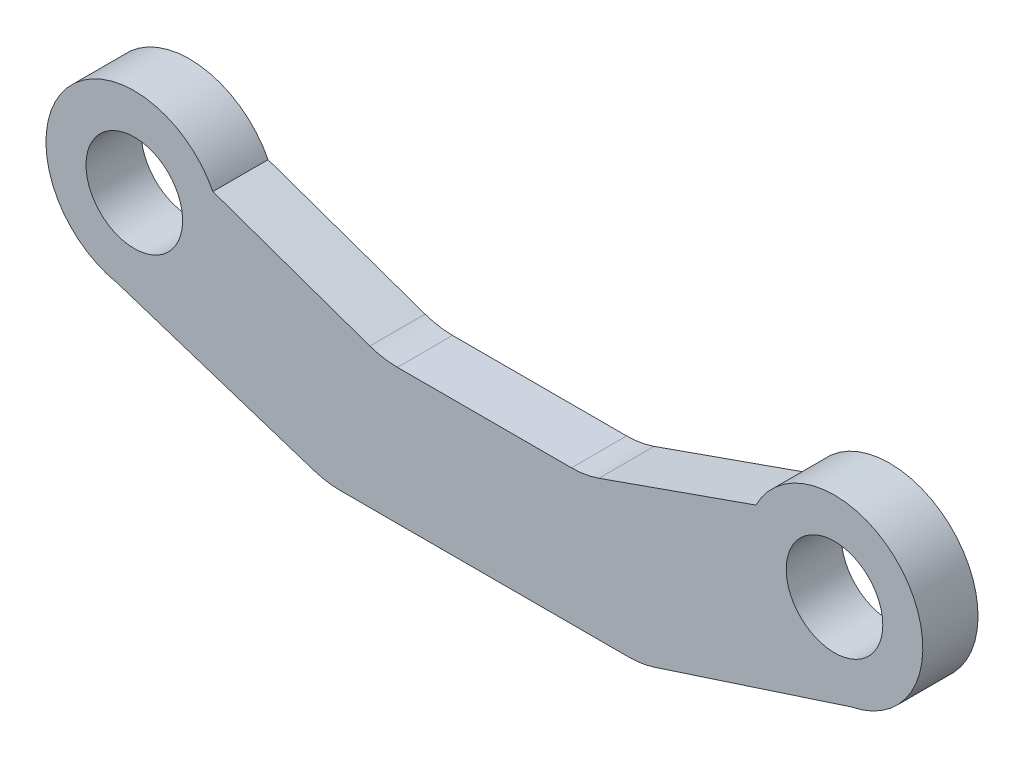
ISO-10303-21;
HEADER;
FILE_DESCRIPTION(('STEP AP214'),'2;1');
FILE_NAME('part.step','',(''),(''),'','','');
FILE_SCHEMA(('AUTOMOTIVE_DESIGN { 1 0 10303 214 1 1 1 1 }'));
ENDSEC;
DATA;
#1=APPLICATION_CONTEXT('core data for automotive mechanical design processes');
#2=APPLICATION_PROTOCOL_DEFINITION('international standard','automotive_design',2000,#1);
#3=PRODUCT_CONTEXT('',#1,'mechanical');
#4=PRODUCT('Part','Part','',(#3));
#5=PRODUCT_RELATED_PRODUCT_CATEGORY('part','',(#4));
#6=PRODUCT_DEFINITION_FORMATION('','',#4);
#7=PRODUCT_DEFINITION_CONTEXT('part definition',#1,'design');
#8=PRODUCT_DEFINITION('design','',#6,#7);
#9=PRODUCT_DEFINITION_SHAPE('','',#8);
#10=(LENGTH_UNIT() NAMED_UNIT(*) SI_UNIT(.MILLI.,.METRE.));
#11=(NAMED_UNIT(*) PLANE_ANGLE_UNIT() SI_UNIT($,.RADIAN.));
#12=(NAMED_UNIT(*) SI_UNIT($,.STERADIAN.) SOLID_ANGLE_UNIT());
#13=UNCERTAINTY_MEASURE_WITH_UNIT(LENGTH_MEASURE(1.E-05),#10,'distance_accuracy_value','');
#14=(GEOMETRIC_REPRESENTATION_CONTEXT(3) GLOBAL_UNCERTAINTY_ASSIGNED_CONTEXT((#13)) GLOBAL_UNIT_ASSIGNED_CONTEXT((#10,
#11,#12)) REPRESENTATION_CONTEXT('',''));
#15=CARTESIAN_POINT('',(0.,0.,0.));
#16=DIRECTION('',(0.,0.,1.));
#17=DIRECTION('',(1.,0.,0.));
#18=AXIS2_PLACEMENT_3D('',#15,#16,#17);
#19=CARTESIAN_POINT('',(6.41938624719755,28.8846796900789,2.));
#20=DIRECTION('',(0.,0.,-1.));
#21=DIRECTION('',(-1.,0.,0.));
#22=AXIS2_PLACEMENT_3D('',#19,#20,#21);
#23=PLANE('',#22);
#24=CARTESIAN_POINT('',(6.41938624719755,28.8846796900789,2.));
#25=DIRECTION('',(0.,0.,1.));
#26=DIRECTION('',(-1.,0.,0.));
#27=AXIS2_PLACEMENT_3D('',#24,#25,#26);
#28=CIRCLE('',#27,3.2);
#29=CARTESIAN_POINT('',(9.26564441233232,30.3471483076579,2.));
#30=VERTEX_POINT('',#29);
#31=CARTESIAN_POINT('',(5.79564441233232,25.7460579984061,2.));
#32=VERTEX_POINT('',#31);
#33=EDGE_CURVE('E200',#30,#32,#28,.T.);
#34=ORIENTED_EDGE('',*,*,#33,.T.);
#35=DIRECTION('',(0.950985081897638,-0.309236760441161,0.));
#36=VECTOR('',#35,1.);
#37=CARTESIAN_POINT('',(12.9434427804246,23.4217712627773,2.));
#38=LINE('',#37,#36);
#39=CARTESIAN_POINT('',(12.9434427804246,23.4217712627773,2.));
#40=VERTEX_POINT('',#39);
#41=EDGE_CURVE('E112',#32,#40,#38,.T.);
#42=ORIENTED_EDGE('',*,*,#41,.T.);
#43=CARTESIAN_POINT('',(13.8711530617481,26.2747265084703,2.));
#44=DIRECTION('',(0.,0.,1.));
#45=DIRECTION('',(1.,0.,0.));
#46=AXIS2_PLACEMENT_3D('',#43,#44,#45);
#47=CIRCLE('',#46,3.);
#48=CARTESIAN_POINT('',(13.8711530617481,23.2747265084703,2.));
#49=VERTEX_POINT('',#48);
#50=EDGE_CURVE('E237',#40,#49,#47,.T.);
#51=ORIENTED_EDGE('',*,*,#50,.T.);
#52=DIRECTION('',(1.,0.,0.));
#53=VECTOR('',#52,1.);
#54=CARTESIAN_POINT('',(13.8711530617481,23.2747265084703,2.));
#55=LINE('',#54,#53);
#56=CARTESIAN_POINT('',(24.3301357629165,23.2747265084703,2.));
#57=VERTEX_POINT('',#56);
#58=EDGE_CURVE('E257',#49,#57,#55,.T.);
#59=ORIENTED_EDGE('',*,*,#58,.T.);
#60=CARTESIAN_POINT('',(24.3301357629165,26.2747265084703,2.));
#61=DIRECTION('',(0.,0.,1.));
#62=DIRECTION('',(1.,0.,0.));
#63=AXIS2_PLACEMENT_3D('',#60,#61,#62);
#64=CIRCLE('',#63,3.);
#65=CARTESIAN_POINT('',(25.25784604424,23.4217712627773,2.));
#66=VERTEX_POINT('',#65);
#67=EDGE_CURVE('E253',#57,#66,#64,.T.);
#68=ORIENTED_EDGE('',*,*,#67,.T.);
#69=DIRECTION('',(0.950985081897637,0.309236760441161,0.));
#70=VECTOR('',#69,1.);
#71=CARTESIAN_POINT('',(25.25784604424,23.4217712627773,2.));
#72=LINE('',#71,#70);
#73=CARTESIAN_POINT('',(32.4056444123323,25.7460579984061,2.));
#74=VERTEX_POINT('',#73);
#75=EDGE_CURVE('E256',#66,#74,#72,.T.);
#76=ORIENTED_EDGE('',*,*,#75,.T.);
#77=CARTESIAN_POINT('',(31.7819025774671,28.8846796900789,2.));
#78=DIRECTION('',(0.,0.,1.));
#79=DIRECTION('',(1.,0.,0.));
#80=AXIS2_PLACEMENT_3D('',#77,#78,#79);
#81=CIRCLE('',#80,3.2);
#82=CARTESIAN_POINT('',(28.9356444123323,30.3471483076579,2.));
#83=VERTEX_POINT('',#82);
#84=EDGE_CURVE('E261',#74,#83,#81,.T.);
#85=ORIENTED_EDGE('',*,*,#84,.T.);
#86=DIRECTION('',(-0.943240770521756,-0.332109693964998,0.));
#87=VECTOR('',#86,1.);
#88=CARTESIAN_POINT('',(23.2492582934097,28.345004196905,2.));
#89=LINE('',#88,#87);
#90=CARTESIAN_POINT('',(23.2492582934097,28.345004196905,2.));
#91=VERTEX_POINT('',#90);
#92=EDGE_CURVE('E268',#83,#91,#89,.T.);
#93=ORIENTED_EDGE('',*,*,#92,.T.);
#94=CARTESIAN_POINT('',(22.2529292115147,31.1747265084703,2.));
#95=DIRECTION('',(0.,0.,-1.));
#96=DIRECTION('',(1.,0.,0.));
#97=AXIS2_PLACEMENT_3D('',#94,#95,#96);
#98=CIRCLE('',#97,3.);
#99=CARTESIAN_POINT('',(22.2529292115147,28.1747265084703,2.));
#100=VERTEX_POINT('',#99);
#101=EDGE_CURVE('E143',#91,#100,#98,.T.);
#102=ORIENTED_EDGE('',*,*,#101,.T.);
#103=DIRECTION('',(-1.,0.,0.));
#104=VECTOR('',#103,1.);
#105=CARTESIAN_POINT('',(15.9483596131499,28.1747265084703,2.));
#106=LINE('',#105,#104);
#107=CARTESIAN_POINT('',(15.9483596131499,28.1747265084703,2.));
#108=VERTEX_POINT('',#107);
#109=EDGE_CURVE('E137',#100,#108,#106,.T.);
#110=ORIENTED_EDGE('',*,*,#109,.T.);
#111=CARTESIAN_POINT('',(15.9483596131499,31.1747265084703,2.));
#112=DIRECTION('',(0.,0.,-1.));
#113=DIRECTION('',(1.,0.,0.));
#114=AXIS2_PLACEMENT_3D('',#111,#112,#113);
#115=CIRCLE('',#114,3.);
#116=CARTESIAN_POINT('',(14.9520305312549,28.345004196905,2.));
#117=VERTEX_POINT('',#116);
#118=EDGE_CURVE('E141',#108,#117,#115,.T.);
#119=ORIENTED_EDGE('',*,*,#118,.T.);
#120=DIRECTION('',(-0.943240770521756,0.332109693964998,0.));
#121=VECTOR('',#120,1.);
#122=CARTESIAN_POINT('',(14.9520305312549,28.345004196905,2.));
#123=LINE('',#122,#121);
#124=EDGE_CURVE('E57',#117,#30,#123,.T.);
#125=ORIENTED_EDGE('',*,*,#124,.T.);
#126=EDGE_LOOP('',(#34,#42,#51,#59,#68,#76,#85,#93,#102,#110,#119,#125));
#127=FACE_BOUND('',#126,.T.);
#128=CARTESIAN_POINT('',(6.41938624719755,28.8846796900789,2.));
#129=DIRECTION('',(0.,0.,1.));
#130=DIRECTION('',(-1.,0.,0.));
#131=AXIS2_PLACEMENT_3D('',#128,#129,#130);
#132=CIRCLE('',#131,1.75);
#133=CARTESIAN_POINT('',(4.66938624719754,28.8846796900789,2.));
#134=VERTEX_POINT('',#133);
#135=EDGE_CURVE('E170',#134,#134,#132,.T.);
#136=ORIENTED_EDGE('',*,*,#135,.F.);
#137=EDGE_LOOP('',(#136));
#138=FACE_BOUND('',#137,.T.);
#139=CARTESIAN_POINT('',(31.7819025774671,28.8846796900789,2.));
#140=DIRECTION('',(0.,0.,1.));
#141=DIRECTION('',(1.,0.,0.));
#142=AXIS2_PLACEMENT_3D('',#139,#140,#141);
#143=CIRCLE('',#142,1.75);
#144=CARTESIAN_POINT('',(33.5319025774671,28.8846796900789,2.));
#145=VERTEX_POINT('',#144);
#146=EDGE_CURVE('E311',#145,#145,#143,.T.);
#147=ORIENTED_EDGE('',*,*,#146,.F.);
#148=EDGE_LOOP('',(#147));
#149=FACE_BOUND('',#148,.T.);
#150=ADVANCED_FACE('F39',(#127,#138,#149),#23,.F.);
#151=CARTESIAN_POINT('',(6.41938624719755,28.8846796900789,0.));
#152=DIRECTION('',(0.,0.,-1.));
#153=DIRECTION('',(-1.,0.,0.));
#154=AXIS2_PLACEMENT_3D('',#151,#152,#153);
#155=PLANE('',#154);
#156=CARTESIAN_POINT('',(6.41938624719755,28.8846796900789,0.));
#157=DIRECTION('',(0.,0.,1.));
#158=DIRECTION('',(-1.,0.,0.));
#159=AXIS2_PLACEMENT_3D('',#156,#157,#158);
#160=CIRCLE('',#159,1.75);
#161=CARTESIAN_POINT('',(4.66938624719754,28.8846796900789,0.));
#162=VERTEX_POINT('',#161);
#163=EDGE_CURVE('E318',#162,#162,#160,.T.);
#164=ORIENTED_EDGE('',*,*,#163,.T.);
#165=EDGE_LOOP('',(#164));
#166=FACE_BOUND('',#165,.T.);
#167=CARTESIAN_POINT('',(6.41938624719755,28.8846796900789,0.));
#168=DIRECTION('',(0.,0.,1.));
#169=DIRECTION('',(-1.,0.,0.));
#170=AXIS2_PLACEMENT_3D('',#167,#168,#169);
#171=CIRCLE('',#170,3.2);
#172=CARTESIAN_POINT('',(9.26564441233232,30.3471483076579,0.));
#173=VERTEX_POINT('',#172);
#174=CARTESIAN_POINT('',(5.79564441233232,25.7460579984061,0.));
#175=VERTEX_POINT('',#174);
#176=EDGE_CURVE('E165',#173,#175,#171,.T.);
#177=ORIENTED_EDGE('',*,*,#176,.F.);
#178=DIRECTION('',(-0.943240770521756,0.332109693964998,0.));
#179=VECTOR('',#178,1.);
#180=CARTESIAN_POINT('',(14.9520305312549,28.345004196905,0.));
#181=LINE('',#180,#179);
#182=CARTESIAN_POINT('',(14.9520305312549,28.345004196905,0.));
#183=VERTEX_POINT('',#182);
#184=EDGE_CURVE('E104',#183,#173,#181,.T.);
#185=ORIENTED_EDGE('',*,*,#184,.F.);
#186=CARTESIAN_POINT('',(15.9483596131499,31.1747265084703,0.));
#187=DIRECTION('',(0.,0.,-1.));
#188=DIRECTION('',(1.,0.,0.));
#189=AXIS2_PLACEMENT_3D('',#186,#187,#188);
#190=CIRCLE('',#189,3.);
#191=CARTESIAN_POINT('',(15.9483596131499,28.1747265084703,0.));
#192=VERTEX_POINT('',#191);
#193=EDGE_CURVE('E98',#192,#183,#190,.T.);
#194=ORIENTED_EDGE('',*,*,#193,.F.);
#195=DIRECTION('',(-1.,0.,0.));
#196=VECTOR('',#195,1.);
#197=CARTESIAN_POINT('',(15.9483596131499,28.1747265084703,0.));
#198=LINE('',#197,#196);
#199=CARTESIAN_POINT('',(22.2529292115147,28.1747265084703,0.));
#200=VERTEX_POINT('',#199);
#201=EDGE_CURVE('E152',#200,#192,#198,.T.);
#202=ORIENTED_EDGE('',*,*,#201,.F.);
#203=CARTESIAN_POINT('',(22.2529292115147,31.1747265084703,0.));
#204=DIRECTION('',(0.,0.,-1.));
#205=DIRECTION('',(1.,0.,0.));
#206=AXIS2_PLACEMENT_3D('',#203,#204,#205);
#207=CIRCLE('',#206,3.);
#208=CARTESIAN_POINT('',(23.2492582934097,28.345004196905,0.));
#209=VERTEX_POINT('',#208);
#210=EDGE_CURVE('E191',#209,#200,#207,.T.);
#211=ORIENTED_EDGE('',*,*,#210,.F.);
#212=DIRECTION('',(-0.943240770521756,-0.332109693964998,0.));
#213=VECTOR('',#212,1.);
#214=CARTESIAN_POINT('',(23.2492582934097,28.345004196905,0.));
#215=LINE('',#214,#213);
#216=CARTESIAN_POINT('',(28.9356444123323,30.3471483076579,0.));
#217=VERTEX_POINT('',#216);
#218=EDGE_CURVE('E188',#217,#209,#215,.T.);
#219=ORIENTED_EDGE('',*,*,#218,.F.);
#220=CARTESIAN_POINT('',(31.7819025774671,28.8846796900789,0.));
#221=DIRECTION('',(0.,0.,1.));
#222=DIRECTION('',(1.,0.,0.));
#223=AXIS2_PLACEMENT_3D('',#220,#221,#222);
#224=CIRCLE('',#223,3.2);
#225=CARTESIAN_POINT('',(32.4056444123323,25.7460579984061,0.));
#226=VERTEX_POINT('',#225);
#227=EDGE_CURVE('E185',#226,#217,#224,.T.);
#228=ORIENTED_EDGE('',*,*,#227,.F.);
#229=DIRECTION('',(0.950985081897637,0.309236760441161,0.));
#230=VECTOR('',#229,1.);
#231=CARTESIAN_POINT('',(25.25784604424,23.4217712627773,0.));
#232=LINE('',#231,#230);
#233=CARTESIAN_POINT('',(25.25784604424,23.4217712627773,0.));
#234=VERTEX_POINT('',#233);
#235=EDGE_CURVE('E182',#234,#226,#232,.T.);
#236=ORIENTED_EDGE('',*,*,#235,.F.);
#237=CARTESIAN_POINT('',(24.3301357629165,26.2747265084703,0.));
#238=DIRECTION('',(0.,0.,1.));
#239=DIRECTION('',(1.,0.,0.));
#240=AXIS2_PLACEMENT_3D('',#237,#238,#239);
#241=CIRCLE('',#240,3.);
#242=CARTESIAN_POINT('',(24.3301357629165,23.2747265084703,0.));
#243=VERTEX_POINT('',#242);
#244=EDGE_CURVE('E179',#243,#234,#241,.T.);
#245=ORIENTED_EDGE('',*,*,#244,.F.);
#246=DIRECTION('',(1.,0.,0.));
#247=VECTOR('',#246,1.);
#248=CARTESIAN_POINT('',(13.8711530617481,23.2747265084703,0.));
#249=LINE('',#248,#247);
#250=CARTESIAN_POINT('',(13.8711530617481,23.2747265084703,0.));
#251=VERTEX_POINT('',#250);
#252=EDGE_CURVE('E176',#251,#243,#249,.T.);
#253=ORIENTED_EDGE('',*,*,#252,.F.);
#254=CARTESIAN_POINT('',(13.8711530617481,26.2747265084703,0.));
#255=DIRECTION('',(0.,0.,1.));
#256=DIRECTION('',(1.,0.,0.));
#257=AXIS2_PLACEMENT_3D('',#254,#255,#256);
#258=CIRCLE('',#257,3.);
#259=CARTESIAN_POINT('',(12.9434427804246,23.4217712627773,0.));
#260=VERTEX_POINT('',#259);
#261=EDGE_CURVE('E173',#260,#251,#258,.T.);
#262=ORIENTED_EDGE('',*,*,#261,.F.);
#263=DIRECTION('',(0.950985081897638,-0.309236760441161,0.));
#264=VECTOR('',#263,1.);
#265=CARTESIAN_POINT('',(12.9434427804246,23.4217712627773,0.));
#266=LINE('',#265,#264);
#267=EDGE_CURVE('E169',#175,#260,#266,.T.);
#268=ORIENTED_EDGE('',*,*,#267,.F.);
#269=EDGE_LOOP('',(#177,#185,#194,#202,#211,#219,#228,#236,#245,#253,#262,#268));
#270=FACE_BOUND('',#269,.T.);
#271=CARTESIAN_POINT('',(31.7819025774671,28.8846796900789,0.));
#272=DIRECTION('',(0.,0.,1.));
#273=DIRECTION('',(1.,0.,0.));
#274=AXIS2_PLACEMENT_3D('',#271,#272,#273);
#275=CIRCLE('',#274,1.75);
#276=CARTESIAN_POINT('',(33.5319025774671,28.8846796900789,0.));
#277=VERTEX_POINT('',#276);
#278=EDGE_CURVE('E314',#277,#277,#275,.T.);
#279=ORIENTED_EDGE('',*,*,#278,.T.);
#280=EDGE_LOOP('',(#279));
#281=FACE_BOUND('',#280,.T.);
#282=ADVANCED_FACE('F241',(#166,#270,#281),#155,.T.);
#283=CARTESIAN_POINT('',(6.41938624719755,28.8846796900789,2.));
#284=DIRECTION('',(0.,0.,-1.));
#285=DIRECTION('',(-1.,0.,0.));
#286=AXIS2_PLACEMENT_3D('',#283,#284,#285);
#287=CYLINDRICAL_SURFACE('',#286,3.2);
#288=ORIENTED_EDGE('',*,*,#176,.T.);
#289=DIRECTION('',(0.,0.,-1.));
#290=VECTOR('',#289,1.);
#291=CARTESIAN_POINT('',(5.79564441233232,25.7460579984061,2.));
#292=LINE('',#291,#290);
#293=EDGE_CURVE('E11',#32,#175,#292,.T.);
#294=ORIENTED_EDGE('',*,*,#293,.F.);
#295=ORIENTED_EDGE('',*,*,#33,.F.);
#296=DIRECTION('',(0.,0.,-1.));
#297=VECTOR('',#296,1.);
#298=CARTESIAN_POINT('',(9.26564441233232,30.3471483076579,2.));
#299=LINE('',#298,#297);
#300=EDGE_CURVE('E161',#30,#173,#299,.T.);
#301=ORIENTED_EDGE('',*,*,#300,.T.);
#302=EDGE_LOOP('',(#288,#294,#295,#301));
#303=FACE_BOUND('',#302,.T.);
#304=ADVANCED_FACE('F41',(#303),#287,.T.);
#305=CARTESIAN_POINT('',(12.9434427804246,23.4217712627773,2.));
#306=DIRECTION('',(0.309236760441161,0.950985081897638,0.));
#307=DIRECTION('',(-0.950985081897638,0.309236760441161,0.));
#308=AXIS2_PLACEMENT_3D('',#305,#306,#307);
#309=PLANE('',#308);
#310=ORIENTED_EDGE('',*,*,#267,.T.);
#311=DIRECTION('',(0.,0.,-1.));
#312=VECTOR('',#311,1.);
#313=CARTESIAN_POINT('',(12.9434427804246,23.4217712627773,2.));
#314=LINE('',#313,#312);
#315=EDGE_CURVE('E49',#40,#260,#314,.T.);
#316=ORIENTED_EDGE('',*,*,#315,.F.);
#317=ORIENTED_EDGE('',*,*,#41,.F.);
#318=ORIENTED_EDGE('',*,*,#293,.T.);
#319=EDGE_LOOP('',(#310,#316,#317,#318));
#320=FACE_BOUND('',#319,.T.);
#321=ADVANCED_FACE('F418',(#320),#309,.F.);
#322=CARTESIAN_POINT('',(13.8711530617481,26.2747265084703,2.));
#323=DIRECTION('',(0.,0.,-1.));
#324=DIRECTION('',(-1.,0.,0.));
#325=AXIS2_PLACEMENT_3D('',#322,#323,#324);
#326=CYLINDRICAL_SURFACE('',#325,3.);
#327=ORIENTED_EDGE('',*,*,#261,.T.);
#328=DIRECTION('',(0.,0.,-1.));
#329=VECTOR('',#328,1.);
#330=CARTESIAN_POINT('',(13.8711530617481,23.2747265084703,2.));
#331=LINE('',#330,#329);
#332=EDGE_CURVE('E227',#49,#251,#331,.T.);
#333=ORIENTED_EDGE('',*,*,#332,.F.);
#334=ORIENTED_EDGE('',*,*,#50,.F.);
#335=ORIENTED_EDGE('',*,*,#315,.T.);
#336=EDGE_LOOP('',(#327,#333,#334,#335));
#337=FACE_BOUND('',#336,.T.);
#338=ADVANCED_FACE('F235',(#337),#326,.T.);
#339=CARTESIAN_POINT('',(13.8711530617481,23.2747265084703,2.));
#340=DIRECTION('',(0.,1.,0.));
#341=DIRECTION('',(0.,0.,1.));
#342=AXIS2_PLACEMENT_3D('',#339,#340,#341);
#343=PLANE('',#342);
#344=ORIENTED_EDGE('',*,*,#252,.T.);
#345=DIRECTION('',(0.,0.,-1.));
#346=VECTOR('',#345,1.);
#347=CARTESIAN_POINT('',(24.3301357629165,23.2747265084703,2.));
#348=LINE('',#347,#346);
#349=EDGE_CURVE('E223',#57,#243,#348,.T.);
#350=ORIENTED_EDGE('',*,*,#349,.F.);
#351=ORIENTED_EDGE('',*,*,#58,.F.);
#352=ORIENTED_EDGE('',*,*,#332,.T.);
#353=EDGE_LOOP('',(#344,#350,#351,#352));
#354=FACE_BOUND('',#353,.T.);
#355=ADVANCED_FACE('F247',(#354),#343,.F.);
#356=CARTESIAN_POINT('',(24.3301357629165,26.2747265084703,2.));
#357=DIRECTION('',(0.,0.,-1.));
#358=DIRECTION('',(-1.,0.,0.));
#359=AXIS2_PLACEMENT_3D('',#356,#357,#358);
#360=CYLINDRICAL_SURFACE('',#359,3.);
#361=ORIENTED_EDGE('',*,*,#244,.T.);
#362=DIRECTION('',(0.,0.,-1.));
#363=VECTOR('',#362,1.);
#364=CARTESIAN_POINT('',(25.25784604424,23.4217712627773,2.));
#365=LINE('',#364,#363);
#366=EDGE_CURVE('E219',#66,#234,#365,.T.);
#367=ORIENTED_EDGE('',*,*,#366,.F.);
#368=ORIENTED_EDGE('',*,*,#67,.F.);
#369=ORIENTED_EDGE('',*,*,#349,.T.);
#370=EDGE_LOOP('',(#361,#367,#368,#369));
#371=FACE_BOUND('',#370,.T.);
#372=ADVANCED_FACE('F251',(#371),#360,.T.);
#373=CARTESIAN_POINT('',(25.25784604424,23.4217712627773,2.));
#374=DIRECTION('',(-0.309236760441161,0.950985081897638,0.));
#375=DIRECTION('',(-0.950985081897638,-0.309236760441161,0.));
#376=AXIS2_PLACEMENT_3D('',#373,#374,#375);
#377=PLANE('',#376);
#378=ORIENTED_EDGE('',*,*,#235,.T.);
#379=DIRECTION('',(0.,0.,-1.));
#380=VECTOR('',#379,1.);
#381=CARTESIAN_POINT('',(32.4056444123323,25.7460579984061,2.));
#382=LINE('',#381,#380);
#383=EDGE_CURVE('E215',#74,#226,#382,.T.);
#384=ORIENTED_EDGE('',*,*,#383,.F.);
#385=ORIENTED_EDGE('',*,*,#75,.F.);
#386=ORIENTED_EDGE('',*,*,#366,.T.);
#387=EDGE_LOOP('',(#378,#384,#385,#386));
#388=FACE_BOUND('',#387,.T.);
#389=ADVANCED_FACE('F383',(#388),#377,.F.);
#390=CARTESIAN_POINT('',(31.7819025774671,28.8846796900789,2.));
#391=DIRECTION('',(0.,0.,-1.));
#392=DIRECTION('',(-1.,0.,0.));
#393=AXIS2_PLACEMENT_3D('',#390,#391,#392);
#394=CYLINDRICAL_SURFACE('',#393,3.2);
#395=ORIENTED_EDGE('',*,*,#227,.T.);
#396=DIRECTION('',(0.,0.,-1.));
#397=VECTOR('',#396,1.);
#398=CARTESIAN_POINT('',(28.9356444123323,30.3471483076579,2.));
#399=LINE('',#398,#397);
#400=EDGE_CURVE('E211',#83,#217,#399,.T.);
#401=ORIENTED_EDGE('',*,*,#400,.F.);
#402=ORIENTED_EDGE('',*,*,#84,.F.);
#403=ORIENTED_EDGE('',*,*,#383,.T.);
#404=EDGE_LOOP('',(#395,#401,#402,#403));
#405=FACE_BOUND('',#404,.T.);
#406=ADVANCED_FACE('F374',(#405),#394,.T.);
#407=CARTESIAN_POINT('',(23.2492582934097,28.345004196905,2.));
#408=DIRECTION('',(0.332109693964998,-0.943240770521756,0.));
#409=DIRECTION('',(0.943240770521756,0.332109693964998,0.));
#410=AXIS2_PLACEMENT_3D('',#407,#408,#409);
#411=PLANE('',#410);
#412=ORIENTED_EDGE('',*,*,#218,.T.);
#413=DIRECTION('',(0.,0.,-1.));
#414=VECTOR('',#413,1.);
#415=CARTESIAN_POINT('',(23.2492582934097,28.345004196905,2.));
#416=LINE('',#415,#414);
#417=EDGE_CURVE('E207',#91,#209,#416,.T.);
#418=ORIENTED_EDGE('',*,*,#417,.F.);
#419=ORIENTED_EDGE('',*,*,#92,.F.);
#420=ORIENTED_EDGE('',*,*,#400,.T.);
#421=EDGE_LOOP('',(#412,#418,#419,#420));
#422=FACE_BOUND('',#421,.T.);
#423=ADVANCED_FACE('F276',(#422),#411,.F.);
#424=CARTESIAN_POINT('',(22.2529292115147,31.1747265084703,2.));
#425=DIRECTION('',(0.,0.,-1.));
#426=DIRECTION('',(-1.,0.,0.));
#427=AXIS2_PLACEMENT_3D('',#424,#425,#426);
#428=CYLINDRICAL_SURFACE('',#427,3.);
#429=ORIENTED_EDGE('',*,*,#210,.T.);
#430=DIRECTION('',(0.,0.,-1.));
#431=VECTOR('',#430,1.);
#432=CARTESIAN_POINT('',(22.2529292115147,28.1747265084703,2.));
#433=LINE('',#432,#431);
#434=EDGE_CURVE('E154',#100,#200,#433,.T.);
#435=ORIENTED_EDGE('',*,*,#434,.F.);
#436=ORIENTED_EDGE('',*,*,#101,.F.);
#437=ORIENTED_EDGE('',*,*,#417,.T.);
#438=EDGE_LOOP('',(#429,#435,#436,#437));
#439=FACE_BOUND('',#438,.T.);
#440=ADVANCED_FACE('F280',(#439),#428,.F.);
#441=CARTESIAN_POINT('',(15.9483596131499,28.1747265084703,2.));
#442=DIRECTION('',(0.,-1.,0.));
#443=DIRECTION('',(0.,0.,-1.));
#444=AXIS2_PLACEMENT_3D('',#441,#442,#443);
#445=PLANE('',#444);
#446=ORIENTED_EDGE('',*,*,#201,.T.);
#447=DIRECTION('',(0.,0.,-1.));
#448=VECTOR('',#447,1.);
#449=CARTESIAN_POINT('',(15.9483596131499,28.1747265084703,2.));
#450=LINE('',#449,#448);
#451=EDGE_CURVE('E149',#108,#192,#450,.T.);
#452=ORIENTED_EDGE('',*,*,#451,.F.);
#453=ORIENTED_EDGE('',*,*,#109,.F.);
#454=ORIENTED_EDGE('',*,*,#434,.T.);
#455=EDGE_LOOP('',(#446,#452,#453,#454));
#456=FACE_BOUND('',#455,.T.);
#457=ADVANCED_FACE('F150',(#456),#445,.F.);
#458=CARTESIAN_POINT('',(15.9483596131499,31.1747265084703,2.));
#459=DIRECTION('',(0.,0.,-1.));
#460=DIRECTION('',(-1.,0.,0.));
#461=AXIS2_PLACEMENT_3D('',#458,#459,#460);
#462=CYLINDRICAL_SURFACE('',#461,3.);
#463=ORIENTED_EDGE('',*,*,#193,.T.);
#464=DIRECTION('',(0.,0.,-1.));
#465=VECTOR('',#464,1.);
#466=CARTESIAN_POINT('',(14.9520305312549,28.345004196905,2.));
#467=LINE('',#466,#465);
#468=EDGE_CURVE('E155',#117,#183,#467,.T.);
#469=ORIENTED_EDGE('',*,*,#468,.F.);
#470=ORIENTED_EDGE('',*,*,#118,.F.);
#471=ORIENTED_EDGE('',*,*,#451,.T.);
#472=EDGE_LOOP('',(#463,#469,#470,#471));
#473=FACE_BOUND('',#472,.T.);
#474=ADVANCED_FACE('F157',(#473),#462,.F.);
#475=CARTESIAN_POINT('',(14.9520305312549,28.345004196905,2.));
#476=DIRECTION('',(-0.332109693964998,-0.943240770521756,0.));
#477=DIRECTION('',(0.943240770521756,-0.332109693964998,0.));
#478=AXIS2_PLACEMENT_3D('',#475,#476,#477);
#479=PLANE('',#478);
#480=ORIENTED_EDGE('',*,*,#184,.T.);
#481=ORIENTED_EDGE('',*,*,#300,.F.);
#482=ORIENTED_EDGE('',*,*,#124,.F.);
#483=ORIENTED_EDGE('',*,*,#468,.T.);
#484=EDGE_LOOP('',(#480,#481,#482,#483));
#485=FACE_BOUND('',#484,.T.);
#486=ADVANCED_FACE('F284',(#485),#479,.F.);
#487=CARTESIAN_POINT('',(6.41938624719755,28.8846796900789,2.));
#488=DIRECTION('',(0.,0.,-1.));
#489=DIRECTION('',(-1.,0.,0.));
#490=AXIS2_PLACEMENT_3D('',#487,#488,#489);
#491=CYLINDRICAL_SURFACE('',#490,1.75);
#492=ORIENTED_EDGE('',*,*,#135,.T.);
#493=EDGE_LOOP('',(#492));
#494=FACE_BOUND('',#493,.T.);
#495=ORIENTED_EDGE('',*,*,#163,.F.);
#496=EDGE_LOOP('',(#495));
#497=FACE_BOUND('',#496,.T.);
#498=ADVANCED_FACE('F286',(#494,#497),#491,.F.);
#499=CARTESIAN_POINT('',(31.7819025774671,28.8846796900789,2.));
#500=DIRECTION('',(0.,0.,-1.));
#501=DIRECTION('',(-1.,0.,0.));
#502=AXIS2_PLACEMENT_3D('',#499,#500,#501);
#503=CYLINDRICAL_SURFACE('',#502,1.75);
#504=ORIENTED_EDGE('',*,*,#146,.T.);
#505=EDGE_LOOP('',(#504));
#506=FACE_BOUND('',#505,.T.);
#507=ORIENTED_EDGE('',*,*,#278,.F.);
#508=EDGE_LOOP('',(#507));
#509=FACE_BOUND('',#508,.T.);
#510=ADVANCED_FACE('F292',(#506,#509),#503,.F.);
#511=CLOSED_SHELL('',(#150,#282,#304,#321,#338,#355,#372,#389,#406,#423,#440,#457,#474,#486,
#498,#510));
#512=MANIFOLD_SOLID_BREP('B2',#511);
#513=ADVANCED_BREP_SHAPE_REPRESENTATION('',(#18,#512),#14);
#514=SHAPE_DEFINITION_REPRESENTATION(#9,#513);
ENDSEC;
END-ISO-10303-21;
